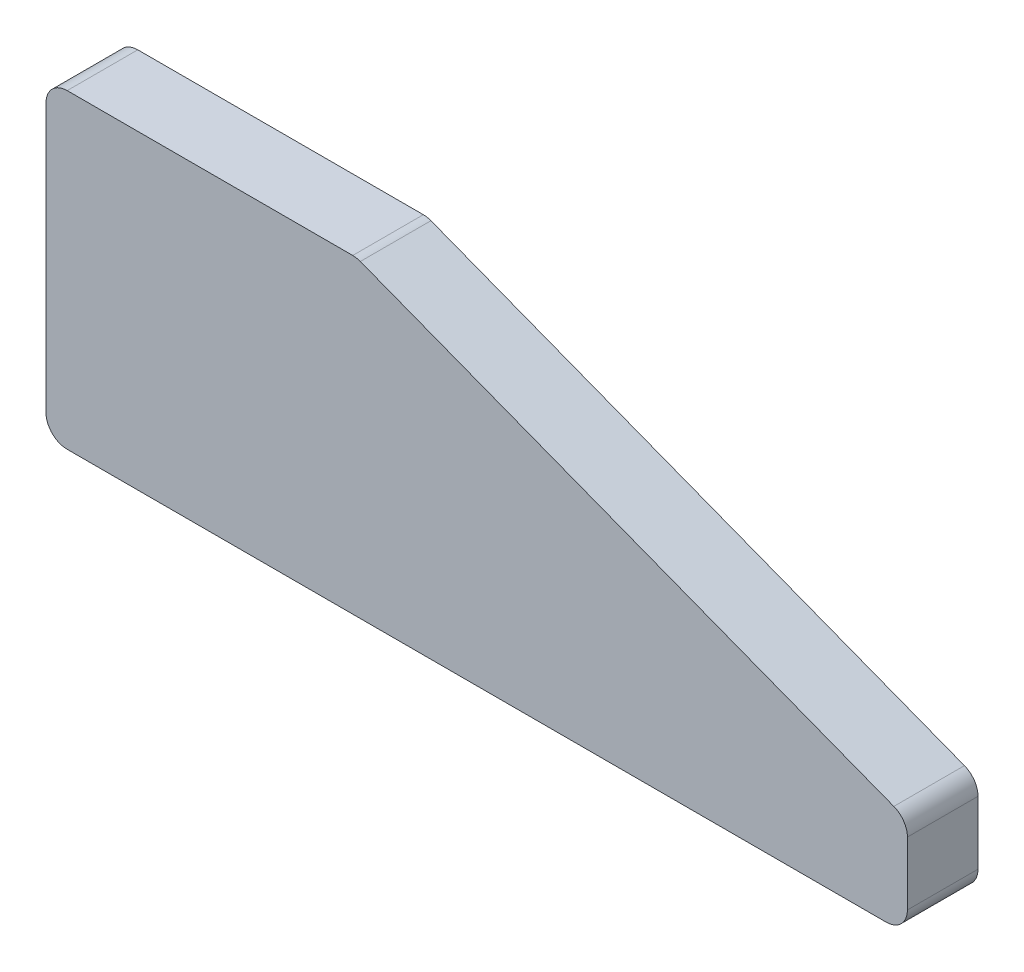
ISO-10303-21;
HEADER;
FILE_DESCRIPTION(('STEP AP214'),'2;1');
FILE_NAME('part.step','',(''),(''),'','','');
FILE_SCHEMA(('AUTOMOTIVE_DESIGN { 1 0 10303 214 1 1 1 1 }'));
ENDSEC;
DATA;
#1=APPLICATION_CONTEXT('core data for automotive mechanical design processes');
#2=APPLICATION_PROTOCOL_DEFINITION('international standard','automotive_design',2000,#1);
#3=PRODUCT_CONTEXT('',#1,'mechanical');
#4=PRODUCT('Part','Part','',(#3));
#5=PRODUCT_RELATED_PRODUCT_CATEGORY('part','',(#4));
#6=PRODUCT_DEFINITION_FORMATION('','',#4);
#7=PRODUCT_DEFINITION_CONTEXT('part definition',#1,'design');
#8=PRODUCT_DEFINITION('design','',#6,#7);
#9=PRODUCT_DEFINITION_SHAPE('','',#8);
#10=(LENGTH_UNIT() NAMED_UNIT(*) SI_UNIT(.MILLI.,.METRE.));
#11=(NAMED_UNIT(*) PLANE_ANGLE_UNIT() SI_UNIT($,.RADIAN.));
#12=(NAMED_UNIT(*) SI_UNIT($,.STERADIAN.) SOLID_ANGLE_UNIT());
#13=UNCERTAINTY_MEASURE_WITH_UNIT(LENGTH_MEASURE(1.E-05),#10,'distance_accuracy_value','');
#14=(GEOMETRIC_REPRESENTATION_CONTEXT(3) GLOBAL_UNCERTAINTY_ASSIGNED_CONTEXT((#13)) GLOBAL_UNIT_ASSIGNED_CONTEXT((#10,
#11,#12)) REPRESENTATION_CONTEXT('',''));
#15=CARTESIAN_POINT('',(0.,0.,0.));
#16=DIRECTION('',(0.,0.,1.));
#17=DIRECTION('',(1.,0.,0.));
#18=AXIS2_PLACEMENT_3D('',#15,#16,#17);
#19=CARTESIAN_POINT('',(-22.,22.,5.));
#20=DIRECTION('',(1.,0.,0.));
#21=DIRECTION('',(0.,0.,-1.));
#22=AXIS2_PLACEMENT_3D('',#19,#20,#21);
#23=PLANE('',#22);
#24=DIRECTION('',(0.,-1.,0.));
#25=VECTOR('',#24,1.);
#26=CARTESIAN_POINT('',(-22.,22.,5.));
#27=LINE('',#26,#25);
#28=CARTESIAN_POINT('',(-22.,19.,5.));
#29=VERTEX_POINT('',#28);
#30=CARTESIAN_POINT('',(-22.,-19.,5.));
#31=VERTEX_POINT('',#30);
#32=EDGE_CURVE('E136',#29,#31,#27,.T.);
#33=ORIENTED_EDGE('',*,*,#32,.F.);
#34=DIRECTION('',(0.,0.,-1.));
#35=VECTOR('',#34,1.);
#36=CARTESIAN_POINT('',(-22.,19.,5.));
#37=LINE('',#36,#35);
#38=CARTESIAN_POINT('',(-22.,19.,-5.));
#39=VERTEX_POINT('',#38);
#40=EDGE_CURVE('E121',#29,#39,#37,.T.);
#41=ORIENTED_EDGE('',*,*,#40,.T.);
#42=DIRECTION('',(0.,-1.,0.));
#43=VECTOR('',#42,1.);
#44=CARTESIAN_POINT('',(-22.,22.,-5.));
#45=LINE('',#44,#43);
#46=CARTESIAN_POINT('',(-22.,-19.,-5.));
#47=VERTEX_POINT('',#46);
#48=EDGE_CURVE('E133',#39,#47,#45,.T.);
#49=ORIENTED_EDGE('',*,*,#48,.T.);
#50=DIRECTION('',(0.,0.,-1.));
#51=VECTOR('',#50,1.);
#52=CARTESIAN_POINT('',(-22.,-19.,5.));
#53=LINE('',#52,#51);
#54=EDGE_CURVE('E138',#47,#31,#53,.F.);
#55=ORIENTED_EDGE('',*,*,#54,.T.);
#56=EDGE_LOOP('',(#33,#41,#49,#55));
#57=FACE_BOUND('',#56,.T.);
#58=ADVANCED_FACE('F39',(#57),#23,.F.);
#59=CARTESIAN_POINT('',(-22.,-22.,5.));
#60=DIRECTION('',(0.,1.,0.));
#61=DIRECTION('',(0.,0.,1.));
#62=AXIS2_PLACEMENT_3D('',#59,#60,#61);
#63=PLANE('',#62);
#64=DIRECTION('',(1.,0.,0.));
#65=VECTOR('',#64,1.);
#66=CARTESIAN_POINT('',(-22.,-22.,-5.));
#67=LINE('',#66,#65);
#68=CARTESIAN_POINT('',(-19.,-22.,-5.));
#69=VERTEX_POINT('',#68);
#70=CARTESIAN_POINT('',(97.,-22.,-5.));
#71=VERTEX_POINT('',#70);
#72=EDGE_CURVE('E142',#69,#71,#67,.T.);
#73=ORIENTED_EDGE('',*,*,#72,.T.);
#74=DIRECTION('',(0.,0.,-1.));
#75=VECTOR('',#74,1.);
#76=CARTESIAN_POINT('',(97.,-22.,5.));
#77=LINE('',#76,#75);
#78=CARTESIAN_POINT('',(97.,-22.,5.));
#79=VERTEX_POINT('',#78);
#80=EDGE_CURVE('E11',#71,#79,#77,.F.);
#81=ORIENTED_EDGE('',*,*,#80,.T.);
#82=DIRECTION('',(1.,0.,0.));
#83=VECTOR('',#82,1.);
#84=CARTESIAN_POINT('',(-22.,-22.,5.));
#85=LINE('',#84,#83);
#86=CARTESIAN_POINT('',(-19.,-22.,5.));
#87=VERTEX_POINT('',#86);
#88=EDGE_CURVE('E191',#87,#79,#85,.T.);
#89=ORIENTED_EDGE('',*,*,#88,.F.);
#90=DIRECTION('',(0.,0.,-1.));
#91=VECTOR('',#90,1.);
#92=CARTESIAN_POINT('',(-19.,-22.,5.));
#93=LINE('',#92,#91);
#94=EDGE_CURVE('E47',#87,#69,#93,.T.);
#95=ORIENTED_EDGE('',*,*,#94,.T.);
#96=EDGE_LOOP('',(#73,#81,#89,#95));
#97=FACE_BOUND('',#96,.T.);
#98=ADVANCED_FACE('F188',(#97),#63,.F.);
#99=CARTESIAN_POINT('',(100.,-22.,5.));
#100=DIRECTION('',(-1.,0.,0.));
#101=DIRECTION('',(0.,0.,1.));
#102=AXIS2_PLACEMENT_3D('',#99,#100,#101);
#103=PLANE('',#102);
#104=DIRECTION('',(0.,1.,0.));
#105=VECTOR('',#104,1.);
#106=CARTESIAN_POINT('',(100.,-22.,-5.));
#107=LINE('',#106,#105);
#108=CARTESIAN_POINT('',(100.,-19.,-5.));
#109=VERTEX_POINT('',#108);
#110=CARTESIAN_POINT('',(100.,-10.0603972947348,-5.));
#111=VERTEX_POINT('',#110);
#112=EDGE_CURVE('E145',#109,#111,#107,.T.);
#113=ORIENTED_EDGE('',*,*,#112,.T.);
#114=DIRECTION('',(0.,0.,-1.));
#115=VECTOR('',#114,1.);
#116=CARTESIAN_POINT('',(100.,-10.0603972947348,5.));
#117=LINE('',#116,#115);
#118=CARTESIAN_POINT('',(100.,-10.0603972947348,5.));
#119=VERTEX_POINT('',#118);
#120=EDGE_CURVE('E183',#111,#119,#117,.F.);
#121=ORIENTED_EDGE('',*,*,#120,.T.);
#122=DIRECTION('',(0.,1.,0.));
#123=VECTOR('',#122,1.);
#124=CARTESIAN_POINT('',(100.,-22.,5.));
#125=LINE('',#124,#123);
#126=CARTESIAN_POINT('',(100.,-19.,5.));
#127=VERTEX_POINT('',#126);
#128=EDGE_CURVE('E203',#127,#119,#125,.T.);
#129=ORIENTED_EDGE('',*,*,#128,.F.);
#130=DIRECTION('',(0.,0.,-1.));
#131=VECTOR('',#130,1.);
#132=CARTESIAN_POINT('',(100.,-19.,5.));
#133=LINE('',#132,#131);
#134=EDGE_CURVE('E180',#127,#109,#133,.T.);
#135=ORIENTED_EDGE('',*,*,#134,.T.);
#136=EDGE_LOOP('',(#113,#121,#129,#135));
#137=FACE_BOUND('',#136,.T.);
#138=ADVANCED_FACE('F201',(#137),#103,.F.);
#139=CARTESIAN_POINT('',(100.,-8.,5.));
#140=DIRECTION('',(-0.358979079308869,-0.93334560620306,0.));
#141=DIRECTION('',(0.93334560620306,-0.358979079308869,0.));
#142=AXIS2_PLACEMENT_3D('',#139,#140,#141);
#143=PLANE('',#142);
#144=DIRECTION('',(-0.93334560620306,0.358979079308869,0.));
#145=VECTOR('',#144,1.);
#146=CARTESIAN_POINT('',(100.,-8.,-5.));
#147=LINE('',#146,#145);
#148=CARTESIAN_POINT('',(98.0769372379266,-7.26036047612562,-5.));
#149=VERTEX_POINT('',#148);
#150=CARTESIAN_POINT('',(22.5199042716161,21.8000368186092,-5.));
#151=VERTEX_POINT('',#150);
#152=EDGE_CURVE('E153',#149,#151,#147,.T.);
#153=ORIENTED_EDGE('',*,*,#152,.T.);
#154=DIRECTION('',(0.,0.,-1.));
#155=VECTOR('',#154,1.);
#156=CARTESIAN_POINT('',(22.5199042716161,21.8000368186092,5.));
#157=LINE('',#156,#155);
#158=CARTESIAN_POINT('',(22.5199042716161,21.8000368186092,5.));
#159=VERTEX_POINT('',#158);
#160=EDGE_CURVE('E54',#151,#159,#157,.F.);
#161=ORIENTED_EDGE('',*,*,#160,.T.);
#162=DIRECTION('',(-0.93334560620306,0.358979079308869,0.));
#163=VECTOR('',#162,1.);
#164=CARTESIAN_POINT('',(100.,-8.,5.));
#165=LINE('',#164,#163);
#166=CARTESIAN_POINT('',(98.0769372379266,-7.26036047612562,5.));
#167=VERTEX_POINT('',#166);
#168=EDGE_CURVE('E204',#167,#159,#165,.T.);
#169=ORIENTED_EDGE('',*,*,#168,.F.);
#170=DIRECTION('',(0.,0.,-1.));
#171=VECTOR('',#170,1.);
#172=CARTESIAN_POINT('',(98.0769372379266,-7.26036047612562,5.));
#173=LINE('',#172,#171);
#174=EDGE_CURVE('E176',#167,#149,#173,.T.);
#175=ORIENTED_EDGE('',*,*,#174,.T.);
#176=EDGE_LOOP('',(#153,#161,#169,#175));
#177=FACE_BOUND('',#176,.T.);
#178=ADVANCED_FACE('F235',(#177),#143,.F.);
#179=CARTESIAN_POINT('',(22.,22.,5.));
#180=DIRECTION('',(0.,-1.,0.));
#181=DIRECTION('',(0.,0.,-1.));
#182=AXIS2_PLACEMENT_3D('',#179,#180,#181);
#183=PLANE('',#182);
#184=DIRECTION('',(-1.,0.,0.));
#185=VECTOR('',#184,1.);
#186=CARTESIAN_POINT('',(22.,22.,-5.));
#187=LINE('',#186,#185);
#188=CARTESIAN_POINT('',(21.4429670336895,22.,-5.));
#189=VERTEX_POINT('',#188);
#190=CARTESIAN_POINT('',(-19.,22.,-5.));
#191=VERTEX_POINT('',#190);
#192=EDGE_CURVE('E155',#189,#191,#187,.T.);
#193=ORIENTED_EDGE('',*,*,#192,.T.);
#194=DIRECTION('',(0.,0.,-1.));
#195=VECTOR('',#194,1.);
#196=CARTESIAN_POINT('',(-19.,22.,5.));
#197=LINE('',#196,#195);
#198=CARTESIAN_POINT('',(-19.,22.,5.));
#199=VERTEX_POINT('',#198);
#200=EDGE_CURVE('E122',#191,#199,#197,.F.);
#201=ORIENTED_EDGE('',*,*,#200,.T.);
#202=DIRECTION('',(-1.,0.,0.));
#203=VECTOR('',#202,1.);
#204=CARTESIAN_POINT('',(22.,22.,5.));
#205=LINE('',#204,#203);
#206=CARTESIAN_POINT('',(21.4429670336895,22.,5.));
#207=VERTEX_POINT('',#206);
#208=EDGE_CURVE('E148',#207,#199,#205,.T.);
#209=ORIENTED_EDGE('',*,*,#208,.F.);
#210=DIRECTION('',(0.,0.,-1.));
#211=VECTOR('',#210,1.);
#212=CARTESIAN_POINT('',(21.4429670336895,22.,5.));
#213=LINE('',#212,#211);
#214=EDGE_CURVE('E127',#207,#189,#213,.T.);
#215=ORIENTED_EDGE('',*,*,#214,.T.);
#216=EDGE_LOOP('',(#193,#201,#209,#215));
#217=FACE_BOUND('',#216,.T.);
#218=ADVANCED_FACE('F240',(#217),#183,.F.);
#219=CARTESIAN_POINT('',(0.,0.,5.));
#220=DIRECTION('',(0.,0.,1.));
#221=DIRECTION('',(1.,0.,0.));
#222=AXIS2_PLACEMENT_3D('',#219,#220,#221);
#223=PLANE('',#222);
#224=ORIENTED_EDGE('',*,*,#208,.T.);
#225=CARTESIAN_POINT('',(-19.,19.,5.));
#226=DIRECTION('',(0.,0.,1.));
#227=DIRECTION('',(1.,0.,0.));
#228=AXIS2_PLACEMENT_3D('',#225,#226,#227);
#229=CIRCLE('',#228,3.);
#230=EDGE_CURVE('E174',#199,#29,#229,.T.);
#231=ORIENTED_EDGE('',*,*,#230,.T.);
#232=ORIENTED_EDGE('',*,*,#32,.T.);
#233=CARTESIAN_POINT('',(-19.,-19.,5.));
#234=DIRECTION('',(0.,0.,1.));
#235=DIRECTION('',(1.,0.,0.));
#236=AXIS2_PLACEMENT_3D('',#233,#234,#235);
#237=CIRCLE('',#236,3.);
#238=EDGE_CURVE('E167',#31,#87,#237,.T.);
#239=ORIENTED_EDGE('',*,*,#238,.T.);
#240=ORIENTED_EDGE('',*,*,#88,.T.);
#241=CARTESIAN_POINT('',(97.,-19.,5.));
#242=DIRECTION('',(0.,0.,1.));
#243=DIRECTION('',(1.,0.,0.));
#244=AXIS2_PLACEMENT_3D('',#241,#242,#243);
#245=CIRCLE('',#244,3.);
#246=EDGE_CURVE('E169',#79,#127,#245,.T.);
#247=ORIENTED_EDGE('',*,*,#246,.T.);
#248=ORIENTED_EDGE('',*,*,#128,.T.);
#249=CARTESIAN_POINT('',(97.,-10.0603972947348,5.));
#250=DIRECTION('',(0.,0.,1.));
#251=DIRECTION('',(1.,0.,0.));
#252=AXIS2_PLACEMENT_3D('',#249,#250,#251);
#253=CIRCLE('',#252,3.);
#254=EDGE_CURVE('E61',#119,#167,#253,.T.);
#255=ORIENTED_EDGE('',*,*,#254,.T.);
#256=ORIENTED_EDGE('',*,*,#168,.T.);
#257=CARTESIAN_POINT('',(21.4429670336895,19.,5.));
#258=DIRECTION('',(0.,0.,1.));
#259=DIRECTION('',(1.,0.,0.));
#260=AXIS2_PLACEMENT_3D('',#257,#258,#259);
#261=CIRCLE('',#260,3.);
#262=EDGE_CURVE('E172',#159,#207,#261,.T.);
#263=ORIENTED_EDGE('',*,*,#262,.T.);
#264=EDGE_LOOP('',(#224,#231,#232,#239,#240,#247,#248,#255,#256,#263));
#265=FACE_BOUND('',#264,.T.);
#266=ADVANCED_FACE('F209',(#265),#223,.T.);
#267=CARTESIAN_POINT('',(0.,0.,-5.));
#268=DIRECTION('',(0.,0.,1.));
#269=DIRECTION('',(1.,0.,0.));
#270=AXIS2_PLACEMENT_3D('',#267,#268,#269);
#271=PLANE('',#270);
#272=ORIENTED_EDGE('',*,*,#48,.F.);
#273=CARTESIAN_POINT('',(-19.,19.,-5.));
#274=DIRECTION('',(0.,0.,1.));
#275=DIRECTION('',(1.,0.,0.));
#276=AXIS2_PLACEMENT_3D('',#273,#274,#275);
#277=CIRCLE('',#276,3.);
#278=EDGE_CURVE('E117',#39,#191,#277,.F.);
#279=ORIENTED_EDGE('',*,*,#278,.T.);
#280=ORIENTED_EDGE('',*,*,#192,.F.);
#281=CARTESIAN_POINT('',(21.4429670336895,19.,-5.));
#282=DIRECTION('',(0.,0.,1.));
#283=DIRECTION('',(1.,0.,0.));
#284=AXIS2_PLACEMENT_3D('',#281,#282,#283);
#285=CIRCLE('',#284,3.);
#286=EDGE_CURVE('E128',#189,#151,#285,.F.);
#287=ORIENTED_EDGE('',*,*,#286,.T.);
#288=ORIENTED_EDGE('',*,*,#152,.F.);
#289=CARTESIAN_POINT('',(97.,-10.0603972947348,-5.));
#290=DIRECTION('',(0.,0.,1.));
#291=DIRECTION('',(1.,0.,0.));
#292=AXIS2_PLACEMENT_3D('',#289,#290,#291);
#293=CIRCLE('',#292,3.);
#294=EDGE_CURVE('E161',#149,#111,#293,.F.);
#295=ORIENTED_EDGE('',*,*,#294,.T.);
#296=ORIENTED_EDGE('',*,*,#112,.F.);
#297=CARTESIAN_POINT('',(97.,-19.,-5.));
#298=DIRECTION('',(0.,0.,1.));
#299=DIRECTION('',(1.,0.,0.));
#300=AXIS2_PLACEMENT_3D('',#297,#298,#299);
#301=CIRCLE('',#300,3.);
#302=EDGE_CURVE('E159',#109,#71,#301,.F.);
#303=ORIENTED_EDGE('',*,*,#302,.T.);
#304=ORIENTED_EDGE('',*,*,#72,.F.);
#305=CARTESIAN_POINT('',(-19.,-19.,-5.));
#306=DIRECTION('',(0.,0.,1.));
#307=DIRECTION('',(1.,0.,0.));
#308=AXIS2_PLACEMENT_3D('',#305,#306,#307);
#309=CIRCLE('',#308,3.);
#310=EDGE_CURVE('E137',#69,#47,#309,.F.);
#311=ORIENTED_EDGE('',*,*,#310,.T.);
#312=EDGE_LOOP('',(#272,#279,#280,#287,#288,#295,#296,#303,#304,#311));
#313=FACE_BOUND('',#312,.T.);
#314=ADVANCED_FACE('F140',(#313),#271,.F.);
#315=CARTESIAN_POINT('',(-19.,19.,5.));
#316=DIRECTION('',(0.,0.,-1.));
#317=DIRECTION('',(-1.,0.,0.));
#318=AXIS2_PLACEMENT_3D('',#315,#316,#317);
#319=CYLINDRICAL_SURFACE('',#318,3.);
#320=ORIENTED_EDGE('',*,*,#230,.F.);
#321=ORIENTED_EDGE('',*,*,#200,.F.);
#322=ORIENTED_EDGE('',*,*,#278,.F.);
#323=ORIENTED_EDGE('',*,*,#40,.F.);
#324=EDGE_LOOP('',(#320,#321,#322,#323));
#325=FACE_BOUND('',#324,.T.);
#326=ADVANCED_FACE('F120',(#325),#319,.T.);
#327=CARTESIAN_POINT('',(21.4429670336895,19.,5.));
#328=DIRECTION('',(0.,0.,-1.));
#329=DIRECTION('',(-1.,0.,0.));
#330=AXIS2_PLACEMENT_3D('',#327,#328,#329);
#331=CYLINDRICAL_SURFACE('',#330,3.);
#332=ORIENTED_EDGE('',*,*,#262,.F.);
#333=ORIENTED_EDGE('',*,*,#160,.F.);
#334=ORIENTED_EDGE('',*,*,#286,.F.);
#335=ORIENTED_EDGE('',*,*,#214,.F.);
#336=EDGE_LOOP('',(#332,#333,#334,#335));
#337=FACE_BOUND('',#336,.T.);
#338=ADVANCED_FACE('F225',(#337),#331,.T.);
#339=CARTESIAN_POINT('',(97.,-10.0603972947348,5.));
#340=DIRECTION('',(0.,0.,-1.));
#341=DIRECTION('',(-1.,0.,0.));
#342=AXIS2_PLACEMENT_3D('',#339,#340,#341);
#343=CYLINDRICAL_SURFACE('',#342,3.);
#344=ORIENTED_EDGE('',*,*,#254,.F.);
#345=ORIENTED_EDGE('',*,*,#120,.F.);
#346=ORIENTED_EDGE('',*,*,#294,.F.);
#347=ORIENTED_EDGE('',*,*,#174,.F.);
#348=EDGE_LOOP('',(#344,#345,#346,#347));
#349=FACE_BOUND('',#348,.T.);
#350=ADVANCED_FACE('F214',(#349),#343,.T.);
#351=CARTESIAN_POINT('',(97.,-19.,5.));
#352=DIRECTION('',(0.,0.,-1.));
#353=DIRECTION('',(-1.,0.,0.));
#354=AXIS2_PLACEMENT_3D('',#351,#352,#353);
#355=CYLINDRICAL_SURFACE('',#354,3.);
#356=ORIENTED_EDGE('',*,*,#246,.F.);
#357=ORIENTED_EDGE('',*,*,#80,.F.);
#358=ORIENTED_EDGE('',*,*,#302,.F.);
#359=ORIENTED_EDGE('',*,*,#134,.F.);
#360=EDGE_LOOP('',(#356,#357,#358,#359));
#361=FACE_BOUND('',#360,.T.);
#362=ADVANCED_FACE('F198',(#361),#355,.T.);
#363=CARTESIAN_POINT('',(-19.,-19.,5.));
#364=DIRECTION('',(0.,0.,-1.));
#365=DIRECTION('',(-1.,0.,0.));
#366=AXIS2_PLACEMENT_3D('',#363,#364,#365);
#367=CYLINDRICAL_SURFACE('',#366,3.);
#368=ORIENTED_EDGE('',*,*,#238,.F.);
#369=ORIENTED_EDGE('',*,*,#54,.F.);
#370=ORIENTED_EDGE('',*,*,#310,.F.);
#371=ORIENTED_EDGE('',*,*,#94,.F.);
#372=EDGE_LOOP('',(#368,#369,#370,#371));
#373=FACE_BOUND('',#372,.T.);
#374=ADVANCED_FACE('F41',(#373),#367,.T.);
#375=CLOSED_SHELL('',(#58,#98,#138,#178,#218,#266,#314,#326,#338,#350,#362,#374));
#376=MANIFOLD_SOLID_BREP('B2',#375);
#377=ADVANCED_BREP_SHAPE_REPRESENTATION('',(#18,#376),#14);
#378=SHAPE_DEFINITION_REPRESENTATION(#9,#377);
ENDSEC;
END-ISO-10303-21;
